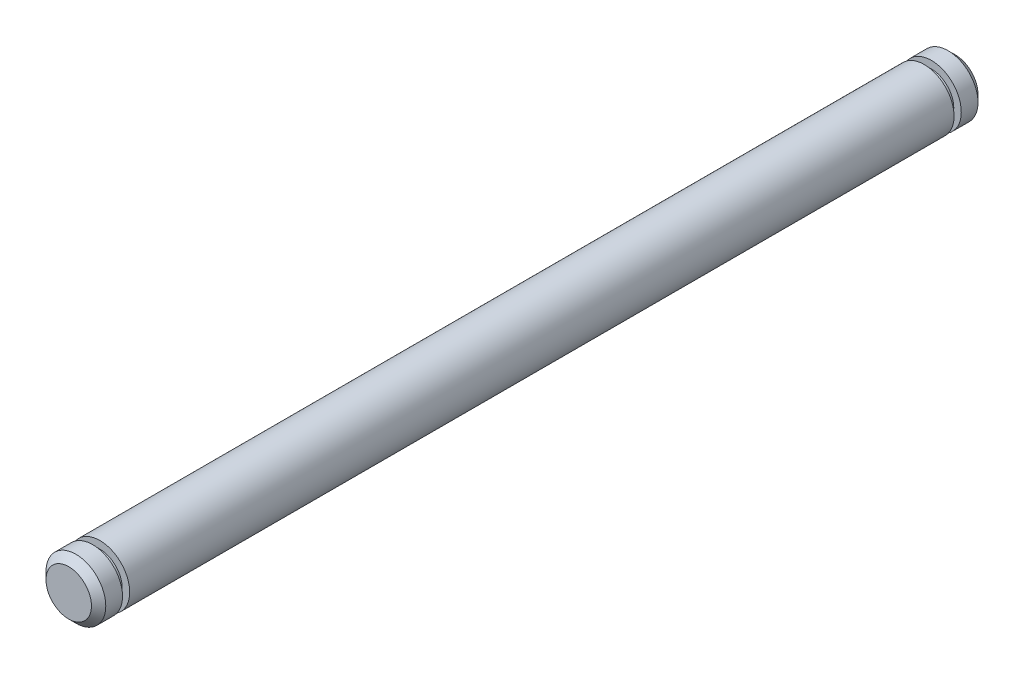
ISO-10303-21;
HEADER;
FILE_DESCRIPTION(('STEP AP214'),'2;1');
FILE_NAME('part.step','',(''),(''),'','','');
FILE_SCHEMA(('AUTOMOTIVE_DESIGN { 1 0 10303 214 1 1 1 1 }'));
ENDSEC;
DATA;
#1=APPLICATION_CONTEXT('core data for automotive mechanical design processes');
#2=APPLICATION_PROTOCOL_DEFINITION('international standard','automotive_design',2000,#1);
#3=PRODUCT_CONTEXT('',#1,'mechanical');
#4=PRODUCT('Part','Part','',(#3));
#5=PRODUCT_RELATED_PRODUCT_CATEGORY('part','',(#4));
#6=PRODUCT_DEFINITION_FORMATION('','',#4);
#7=PRODUCT_DEFINITION_CONTEXT('part definition',#1,'design');
#8=PRODUCT_DEFINITION('design','',#6,#7);
#9=PRODUCT_DEFINITION_SHAPE('','',#8);
#10=(LENGTH_UNIT() NAMED_UNIT(*) SI_UNIT(.MILLI.,.METRE.));
#11=(NAMED_UNIT(*) PLANE_ANGLE_UNIT() SI_UNIT($,.RADIAN.));
#12=(NAMED_UNIT(*) SI_UNIT($,.STERADIAN.) SOLID_ANGLE_UNIT());
#13=UNCERTAINTY_MEASURE_WITH_UNIT(LENGTH_MEASURE(1.E-05),#10,'distance_accuracy_value','');
#14=(GEOMETRIC_REPRESENTATION_CONTEXT(3) GLOBAL_UNCERTAINTY_ASSIGNED_CONTEXT((#13)) GLOBAL_UNIT_ASSIGNED_CONTEXT((#10,
#11,#12)) REPRESENTATION_CONTEXT('',''));
#15=CARTESIAN_POINT('',(0.,0.,0.));
#16=DIRECTION('',(0.,0.,1.));
#17=DIRECTION('',(1.,0.,0.));
#18=AXIS2_PLACEMENT_3D('',#15,#16,#17);
#19=CARTESIAN_POINT('',(0.,0.,21.89226));
#20=DIRECTION('',(0.,0.,-1.));
#21=DIRECTION('',(-1.,0.,0.));
#22=AXIS2_PLACEMENT_3D('',#19,#20,#21);
#23=CYLINDRICAL_SURFACE('',#22,1.5875);
#24=CARTESIAN_POINT('',(0.,0.,21.89226));
#25=DIRECTION('',(0.,0.,1.));
#26=DIRECTION('',(1.,0.,0.));
#27=AXIS2_PLACEMENT_3D('',#24,#25,#26);
#28=CIRCLE('',#27,1.5875);
#29=CARTESIAN_POINT('',(-1.5875,0.,21.89226));
#30=VERTEX_POINT('',#29);
#31=EDGE_CURVE('E68',#30,#30,#28,.T.);
#32=CARTESIAN_POINT('',(0.,0.,-21.89226));
#33=DIRECTION('',(0.,0.,1.));
#34=DIRECTION('',(1.,0.,0.));
#35=AXIS2_PLACEMENT_3D('',#32,#33,#34);
#36=CIRCLE('',#35,1.5875);
#37=CARTESIAN_POINT('',(-1.5875,0.,-21.89226));
#38=VERTEX_POINT('',#37);
#39=EDGE_CURVE('E65',#38,#38,#36,.T.);
#40=CARTESIAN_POINT('',(-1.5875,0.,21.89226));
#41=CARTESIAN_POINT('',(-1.5875,0.,21.43617125));
#42=CARTESIAN_POINT('',(-1.5875,0.,20.9800825));
#43=CARTESIAN_POINT('',(-1.5875,0.,20.067905));
#44=CARTESIAN_POINT('',(-1.5875,0.,19.61181625));
#45=CARTESIAN_POINT('',(-1.5875,0.,18.69963875));
#46=CARTESIAN_POINT('',(-1.5875,0.,18.24355));
#47=CARTESIAN_POINT('',(-1.5875,0.,17.3313725));
#48=CARTESIAN_POINT('',(-1.5875,0.,16.87528375));
#49=CARTESIAN_POINT('',(-1.5875,0.,15.96310625));
#50=CARTESIAN_POINT('',(-1.5875,0.,15.5070175));
#51=CARTESIAN_POINT('',(-1.5875,0.,14.59484));
#52=CARTESIAN_POINT('',(-1.5875,0.,14.13875125));
#53=CARTESIAN_POINT('',(-1.5875,0.,13.22657375));
#54=CARTESIAN_POINT('',(-1.5875,0.,12.770485));
#55=CARTESIAN_POINT('',(-1.5875,0.,11.8583075));
#56=CARTESIAN_POINT('',(-1.5875,0.,11.40221875));
#57=CARTESIAN_POINT('',(-1.5875,0.,10.49004125));
#58=CARTESIAN_POINT('',(-1.5875,0.,10.0339525));
#59=CARTESIAN_POINT('',(-1.5875,0.,9.121775));
#60=CARTESIAN_POINT('',(-1.5875,0.,8.66568625));
#61=CARTESIAN_POINT('',(-1.5875,0.,7.75350875));
#62=CARTESIAN_POINT('',(-1.5875,0.,7.29742));
#63=CARTESIAN_POINT('',(-1.5875,0.,6.3852425));
#64=CARTESIAN_POINT('',(-1.5875,0.,5.92915375));
#65=CARTESIAN_POINT('',(-1.5875,0.,5.01697625));
#66=CARTESIAN_POINT('',(-1.5875,0.,4.5608875));
#67=CARTESIAN_POINT('',(-1.5875,0.,3.64871));
#68=CARTESIAN_POINT('',(-1.5875,0.,3.19262125));
#69=CARTESIAN_POINT('',(-1.5875,0.,2.28044375));
#70=CARTESIAN_POINT('',(-1.5875,0.,1.824355));
#71=CARTESIAN_POINT('',(-1.5875,0.,0.912177499999996));
#72=CARTESIAN_POINT('',(-1.5875,0.,0.456088749999996));
#73=CARTESIAN_POINT('',(-1.5875,0.,-0.456088750000003));
#74=CARTESIAN_POINT('',(-1.5875,0.,-0.912177500000003));
#75=CARTESIAN_POINT('',(-1.5875,0.,-1.824355));
#76=CARTESIAN_POINT('',(-1.5875,0.,-2.28044375));
#77=CARTESIAN_POINT('',(-1.5875,0.,-3.19262125));
#78=CARTESIAN_POINT('',(-1.5875,0.,-3.64871));
#79=CARTESIAN_POINT('',(-1.5875,0.,-4.5608875));
#80=CARTESIAN_POINT('',(-1.5875,0.,-5.01697625));
#81=CARTESIAN_POINT('',(-1.5875,0.,-5.92915375));
#82=CARTESIAN_POINT('',(-1.5875,0.,-6.3852425));
#83=CARTESIAN_POINT('',(-1.5875,0.,-7.29742000000001));
#84=CARTESIAN_POINT('',(-1.5875,0.,-7.75350875000001));
#85=CARTESIAN_POINT('',(-1.5875,0.,-8.66568625));
#86=CARTESIAN_POINT('',(-1.5875,0.,-9.121775));
#87=CARTESIAN_POINT('',(-1.5875,0.,-10.0339525));
#88=CARTESIAN_POINT('',(-1.5875,0.,-10.49004125));
#89=CARTESIAN_POINT('',(-1.5875,0.,-11.40221875));
#90=CARTESIAN_POINT('',(-1.5875,0.,-11.8583075));
#91=CARTESIAN_POINT('',(-1.5875,0.,-12.770485));
#92=CARTESIAN_POINT('',(-1.5875,0.,-13.22657375));
#93=CARTESIAN_POINT('',(-1.5875,0.,-14.13875125));
#94=CARTESIAN_POINT('',(-1.5875,0.,-14.59484));
#95=CARTESIAN_POINT('',(-1.5875,0.,-15.5070175));
#96=CARTESIAN_POINT('',(-1.5875,0.,-15.96310625));
#97=CARTESIAN_POINT('',(-1.5875,0.,-16.87528375));
#98=CARTESIAN_POINT('',(-1.5875,0.,-17.3313725));
#99=CARTESIAN_POINT('',(-1.5875,0.,-18.24355));
#100=CARTESIAN_POINT('',(-1.5875,0.,-18.69963875));
#101=CARTESIAN_POINT('',(-1.5875,0.,-19.61181625));
#102=CARTESIAN_POINT('',(-1.5875,0.,-20.067905));
#103=CARTESIAN_POINT('',(-1.5875,0.,-20.9800825));
#104=CARTESIAN_POINT('',(-1.5875,0.,-21.43617125));
#105=CARTESIAN_POINT('',(-1.5875,0.,-21.89226));
#106=B_SPLINE_CURVE_WITH_KNOTS('',3,(#40,#41,#42,#43,#44,#45,#46,#47,#48,#49,#50,#51,#52,#53,
#54,#55,#56,#57,#58,#59,#60,#61,#62,#63,#64,#65,#66,#67,#68,#69,#70,#71,#72,#73,#74,#75,#76,#77,
#78,#79,#80,#81,#82,#83,#84,#85,#86,#87,#88,#89,#90,#91,#92,#93,#94,#95,#96,#97,#98,#99,#100,
#101,#102,#103,#104,#105),.UNSPECIFIED.,.F.,.F.,(4,2,2,2,2,2,2,2,2,2,2,2,2,2,2,2,2,2,2,2,2,2,2,
2,2,2,2,2,2,2,2,2,4),(0.,1.36826625,2.7365325,4.10479875,5.473065,6.84133125,8.2095975,
9.57786375,10.94613,12.31439625,13.6826625,15.05092875,16.419195,17.78746125,19.1557275,
20.52399375,21.89226,23.26052625,24.6287925,25.99705875,27.365325,28.73359125,30.1018575,
31.47012375,32.83839,34.20665625,35.5749225,36.94318875,38.311455,39.67972125,41.0479875,
42.41625375,43.78452),.UNSPECIFIED.);
#107=EDGE_CURVE('BSEAM43',#30,#38,#106,.T.);
#108=ORIENTED_EDGE('',*,*,#31,.F.);
#109=ORIENTED_EDGE('',*,*,#39,.T.);
#110=ORIENTED_EDGE('',*,*,#107,.T.);
#111=ORIENTED_EDGE('',*,*,#107,.F.);
#112=EDGE_LOOP('',(#108,#110,#109,#111));
#113=FACE_BOUND('',#112,.T.);
#114=ADVANCED_FACE('F43',(#113),#23,.T.);
#115=CARTESIAN_POINT('',(0.,0.,21.89226));
#116=DIRECTION('',(0.,0.,1.));
#117=DIRECTION('',(1.,0.,0.));
#118=AXIS2_PLACEMENT_3D('',#115,#116,#117);
#119=PLANE('',#118);
#120=CARTESIAN_POINT('',(0.,0.,21.89226));
#121=DIRECTION('',(0.,0.,1.));
#122=DIRECTION('',(1.,0.,0.));
#123=AXIS2_PLACEMENT_3D('',#120,#121,#122);
#124=CIRCLE('',#123,1.19126);
#125=CARTESIAN_POINT('',(-1.19126,0.,21.89226));
#126=VERTEX_POINT('',#125);
#127=EDGE_CURVE('E64',#126,#126,#124,.T.);
#128=ORIENTED_EDGE('',*,*,#127,.F.);
#129=EDGE_LOOP('',(#128));
#130=FACE_BOUND('',#129,.T.);
#131=ORIENTED_EDGE('',*,*,#31,.T.);
#132=EDGE_LOOP('',(#131));
#133=FACE_BOUND('',#132,.T.);
#134=ADVANCED_FACE('F106',(#130,#133),#119,.T.);
#135=CARTESIAN_POINT('',(0.,0.,-21.89226));
#136=DIRECTION('',(0.,0.,1.));
#137=DIRECTION('',(1.,0.,0.));
#138=AXIS2_PLACEMENT_3D('',#135,#136,#137);
#139=PLANE('',#138);
#140=CARTESIAN_POINT('',(0.,0.,-21.89226));
#141=DIRECTION('',(0.,0.,1.));
#142=DIRECTION('',(1.,0.,0.));
#143=AXIS2_PLACEMENT_3D('',#140,#141,#142);
#144=CIRCLE('',#143,1.19126);
#145=CARTESIAN_POINT('',(1.19126,0.,-21.89226));
#146=VERTEX_POINT('',#145);
#147=EDGE_CURVE('E79',#146,#146,#144,.T.);
#148=ORIENTED_EDGE('',*,*,#147,.T.);
#149=EDGE_LOOP('',(#148));
#150=FACE_BOUND('',#149,.T.);
#151=ORIENTED_EDGE('',*,*,#39,.F.);
#152=EDGE_LOOP('',(#151));
#153=FACE_BOUND('',#152,.T.);
#154=ADVANCED_FACE('F112',(#150,#153),#139,.F.);
#155=CARTESIAN_POINT('',(0.,0.,22.27326));
#156=DIRECTION('',(0.,0.,-1.));
#157=DIRECTION('',(-1.,0.,0.));
#158=AXIS2_PLACEMENT_3D('',#155,#156,#157);
#159=CYLINDRICAL_SURFACE('',#158,1.19126);
#160=CARTESIAN_POINT('',(0.,0.,22.27326));
#161=DIRECTION('',(0.,0.,1.));
#162=DIRECTION('',(1.,0.,0.));
#163=AXIS2_PLACEMENT_3D('',#160,#161,#162);
#164=CIRCLE('',#163,1.19126);
#165=CARTESIAN_POINT('',(-1.19126,0.,22.27326));
#166=VERTEX_POINT('',#165);
#167=EDGE_CURVE('E69',#166,#166,#164,.T.);
#168=CARTESIAN_POINT('',(-1.19126,0.,22.27326));
#169=CARTESIAN_POINT('',(-1.19126,0.,22.26929125));
#170=CARTESIAN_POINT('',(-1.19126,0.,22.2653225));
#171=CARTESIAN_POINT('',(-1.19126,0.,22.257385));
#172=CARTESIAN_POINT('',(-1.19126,0.,22.25341625));
#173=CARTESIAN_POINT('',(-1.19126,0.,22.24547875));
#174=CARTESIAN_POINT('',(-1.19126,0.,22.24151));
#175=CARTESIAN_POINT('',(-1.19126,0.,22.2335725));
#176=CARTESIAN_POINT('',(-1.19126,0.,22.22960375));
#177=CARTESIAN_POINT('',(-1.19126,0.,22.22166625));
#178=CARTESIAN_POINT('',(-1.19126,0.,22.2176975));
#179=CARTESIAN_POINT('',(-1.19126,0.,22.20976));
#180=CARTESIAN_POINT('',(-1.19126,0.,22.20579125));
#181=CARTESIAN_POINT('',(-1.19126,0.,22.19785375));
#182=CARTESIAN_POINT('',(-1.19126,0.,22.193885));
#183=CARTESIAN_POINT('',(-1.19126,0.,22.1859475));
#184=CARTESIAN_POINT('',(-1.19126,0.,22.18197875));
#185=CARTESIAN_POINT('',(-1.19126,0.,22.17404125));
#186=CARTESIAN_POINT('',(-1.19126,0.,22.1700725));
#187=CARTESIAN_POINT('',(-1.19126,0.,22.162135));
#188=CARTESIAN_POINT('',(-1.19126,0.,22.15816625));
#189=CARTESIAN_POINT('',(-1.19126,0.,22.15022875));
#190=CARTESIAN_POINT('',(-1.19126,0.,22.14626));
#191=CARTESIAN_POINT('',(-1.19126,0.,22.1383225));
#192=CARTESIAN_POINT('',(-1.19126,0.,22.13435375));
#193=CARTESIAN_POINT('',(-1.19126,0.,22.12641625));
#194=CARTESIAN_POINT('',(-1.19126,0.,22.1224475));
#195=CARTESIAN_POINT('',(-1.19126,0.,22.11451));
#196=CARTESIAN_POINT('',(-1.19126,0.,22.11054125));
#197=CARTESIAN_POINT('',(-1.19126,0.,22.10260375));
#198=CARTESIAN_POINT('',(-1.19126,0.,22.098635));
#199=CARTESIAN_POINT('',(-1.19126,0.,22.0906975));
#200=CARTESIAN_POINT('',(-1.19126,0.,22.08672875));
#201=CARTESIAN_POINT('',(-1.19126,0.,22.07879125));
#202=CARTESIAN_POINT('',(-1.19126,0.,22.0748225));
#203=CARTESIAN_POINT('',(-1.19126,0.,22.066885));
#204=CARTESIAN_POINT('',(-1.19126,0.,22.06291625));
#205=CARTESIAN_POINT('',(-1.19126,0.,22.05497875));
#206=CARTESIAN_POINT('',(-1.19126,0.,22.05101));
#207=CARTESIAN_POINT('',(-1.19126,0.,22.0430725));
#208=CARTESIAN_POINT('',(-1.19126,0.,22.03910375));
#209=CARTESIAN_POINT('',(-1.19126,0.,22.03116625));
#210=CARTESIAN_POINT('',(-1.19126,0.,22.0271975));
#211=CARTESIAN_POINT('',(-1.19126,0.,22.01926));
#212=CARTESIAN_POINT('',(-1.19126,0.,22.01529125));
#213=CARTESIAN_POINT('',(-1.19126,0.,22.00735375));
#214=CARTESIAN_POINT('',(-1.19126,0.,22.003385));
#215=CARTESIAN_POINT('',(-1.19126,0.,21.9954475));
#216=CARTESIAN_POINT('',(-1.19126,0.,21.99147875));
#217=CARTESIAN_POINT('',(-1.19126,0.,21.98354125));
#218=CARTESIAN_POINT('',(-1.19126,0.,21.9795725));
#219=CARTESIAN_POINT('',(-1.19126,0.,21.971635));
#220=CARTESIAN_POINT('',(-1.19126,0.,21.96766625));
#221=CARTESIAN_POINT('',(-1.19126,0.,21.95972875));
#222=CARTESIAN_POINT('',(-1.19126,0.,21.95576));
#223=CARTESIAN_POINT('',(-1.19126,0.,21.9478225));
#224=CARTESIAN_POINT('',(-1.19126,0.,21.94385375));
#225=CARTESIAN_POINT('',(-1.19126,0.,21.93591625));
#226=CARTESIAN_POINT('',(-1.19126,0.,21.9319475));
#227=CARTESIAN_POINT('',(-1.19126,0.,21.92401));
#228=CARTESIAN_POINT('',(-1.19126,0.,21.92004125));
#229=CARTESIAN_POINT('',(-1.19126,0.,21.91210375));
#230=CARTESIAN_POINT('',(-1.19126,0.,21.908135));
#231=CARTESIAN_POINT('',(-1.19126,0.,21.9001975));
#232=CARTESIAN_POINT('',(-1.19126,0.,21.89622875));
#233=CARTESIAN_POINT('',(-1.19126,0.,21.89226));
#234=B_SPLINE_CURVE_WITH_KNOTS('',3,(#168,#169,#170,#171,#172,#173,#174,#175,#176,#177,#178,
#179,#180,#181,#182,#183,#184,#185,#186,#187,#188,#189,#190,#191,#192,#193,#194,#195,#196,#197,
#198,#199,#200,#201,#202,#203,#204,#205,#206,#207,#208,#209,#210,#211,#212,#213,#214,#215,#216,
#217,#218,#219,#220,#221,#222,#223,#224,#225,#226,#227,#228,#229,#230,#231,#232,#233),
.UNSPECIFIED.,.F.,.F.,(4,2,2,2,2,2,2,2,2,2,2,2,2,2,2,2,2,2,2,2,2,2,2,2,2,2,2,2,2,2,2,2,4),(0.,
0.0119062499999989,0.0238124999999978,0.0357187499999967,0.0476249999999991,0.059531249999998,
0.0714374999999969,0.0833437499999992,0.0952499999999981,0.107156249999997,0.119062499999999,
0.130968749999998,0.142874999999997,0.15478125,0.166687499999998,0.178593749999997,
0.190499999999996,0.202406249999999,0.214312499999997,0.226218749999996,0.238124999999999,
0.250031249999998,0.261937499999997,0.273843749999999,0.285749999999998,0.297656249999997,
0.309562499999999,0.321468749999998,0.333374999999997,0.345281249999999,0.357187499999998,
0.369093749999997,0.380999999999996),.UNSPECIFIED.);
#235=EDGE_CURVE('BSEAM141',#166,#126,#234,.T.);
#236=ORIENTED_EDGE('',*,*,#167,.F.);
#237=ORIENTED_EDGE('',*,*,#127,.T.);
#238=ORIENTED_EDGE('',*,*,#235,.T.);
#239=ORIENTED_EDGE('',*,*,#235,.F.);
#240=EDGE_LOOP('',(#236,#238,#237,#239));
#241=FACE_BOUND('',#240,.T.);
#242=ADVANCED_FACE('F141',(#241),#159,.T.);
#243=CARTESIAN_POINT('',(0.,0.,23.54326));
#244=DIRECTION('',(0.,0.,-1.));
#245=DIRECTION('',(-1.,0.,0.));
#246=AXIS2_PLACEMENT_3D('',#243,#244,#245);
#247=CYLINDRICAL_SURFACE('',#246,1.5875);
#248=CARTESIAN_POINT('',(0.,0.,23.16226));
#249=DIRECTION('',(0.,0.,1.));
#250=DIRECTION('',(1.,0.,0.));
#251=AXIS2_PLACEMENT_3D('',#248,#249,#250);
#252=CIRCLE('',#251,1.5875);
#253=CARTESIAN_POINT('',(1.5875,0.,23.16226));
#254=VERTEX_POINT('',#253);
#255=EDGE_CURVE('E55',#254,#254,#252,.F.);
#256=ORIENTED_EDGE('',*,*,#255,.T.);
#257=EDGE_LOOP('',(#256));
#258=FACE_BOUND('',#257,.T.);
#259=CARTESIAN_POINT('',(0.,0.,22.27326));
#260=DIRECTION('',(0.,0.,1.));
#261=DIRECTION('',(1.,0.,0.));
#262=AXIS2_PLACEMENT_3D('',#259,#260,#261);
#263=CIRCLE('',#262,1.5875);
#264=CARTESIAN_POINT('',(1.5875,0.,22.27326));
#265=VERTEX_POINT('',#264);
#266=EDGE_CURVE('E76',#265,#265,#263,.T.);
#267=ORIENTED_EDGE('',*,*,#266,.T.);
#268=EDGE_LOOP('',(#267));
#269=FACE_BOUND('',#268,.T.);
#270=ADVANCED_FACE('F136',(#258,#269),#247,.T.);
#271=CARTESIAN_POINT('',(0.,0.,23.54326));
#272=DIRECTION('',(0.,0.,1.));
#273=DIRECTION('',(1.,0.,0.));
#274=AXIS2_PLACEMENT_3D('',#271,#272,#273);
#275=PLANE('',#274);
#276=CARTESIAN_POINT('',(0.,0.,23.54326));
#277=DIRECTION('',(0.,0.,1.));
#278=DIRECTION('',(1.,0.,0.));
#279=AXIS2_PLACEMENT_3D('',#276,#277,#278);
#280=CIRCLE('',#279,1.20650000000001);
#281=CARTESIAN_POINT('',(1.20650000000001,0.,23.54326));
#282=VERTEX_POINT('',#281);
#283=EDGE_CURVE('E59',#282,#282,#280,.T.);
#284=ORIENTED_EDGE('',*,*,#283,.T.);
#285=EDGE_LOOP('',(#284));
#286=FACE_BOUND('',#285,.T.);
#287=ADVANCED_FACE('F129',(#286),#275,.T.);
#288=CARTESIAN_POINT('',(0.,0.,22.27326));
#289=DIRECTION('',(0.,0.,1.));
#290=DIRECTION('',(1.,0.,0.));
#291=AXIS2_PLACEMENT_3D('',#288,#289,#290);
#292=PLANE('',#291);
#293=ORIENTED_EDGE('',*,*,#167,.T.);
#294=EDGE_LOOP('',(#293));
#295=FACE_BOUND('',#294,.T.);
#296=ORIENTED_EDGE('',*,*,#266,.F.);
#297=EDGE_LOOP('',(#296));
#298=FACE_BOUND('',#297,.T.);
#299=ADVANCED_FACE('F122',(#295,#298),#292,.F.);
#300=CARTESIAN_POINT('',(0.,0.,23.54326));
#301=DIRECTION('',(0.,0.,-1.));
#302=DIRECTION('',(-1.,0.,0.));
#303=AXIS2_PLACEMENT_3D('',#300,#301,#302);
#304=CONICAL_SURFACE('',#303,1.20650000000001,0.785398163397441);
#305=ORIENTED_EDGE('',*,*,#255,.F.);
#306=EDGE_LOOP('',(#305));
#307=FACE_BOUND('',#306,.T.);
#308=ORIENTED_EDGE('',*,*,#283,.F.);
#309=EDGE_LOOP('',(#308));
#310=FACE_BOUND('',#309,.T.);
#311=ADVANCED_FACE('F101',(#307,#310),#304,.T.);
#312=CARTESIAN_POINT('',(0.,0.,-22.27326));
#313=DIRECTION('',(0.,0.,1.));
#314=DIRECTION('',(1.,0.,0.));
#315=AXIS2_PLACEMENT_3D('',#312,#313,#314);
#316=CYLINDRICAL_SURFACE('',#315,1.19126);
#317=CARTESIAN_POINT('',(0.,0.,-22.27326));
#318=DIRECTION('',(0.,0.,1.));
#319=DIRECTION('',(1.,0.,0.));
#320=AXIS2_PLACEMENT_3D('',#317,#318,#319);
#321=CIRCLE('',#320,1.19126);
#322=CARTESIAN_POINT('',(1.19126,0.,-22.27326));
#323=VERTEX_POINT('',#322);
#324=EDGE_CURVE('E82',#323,#323,#321,.T.);
#325=CARTESIAN_POINT('',(1.19126,0.,-22.27326));
#326=CARTESIAN_POINT('',(1.19126,0.,-22.26929125));
#327=CARTESIAN_POINT('',(1.19126,0.,-22.2653225));
#328=CARTESIAN_POINT('',(1.19126,0.,-22.257385));
#329=CARTESIAN_POINT('',(1.19126,0.,-22.25341625));
#330=CARTESIAN_POINT('',(1.19126,0.,-22.24547875));
#331=CARTESIAN_POINT('',(1.19126,0.,-22.24151));
#332=CARTESIAN_POINT('',(1.19126,0.,-22.2335725));
#333=CARTESIAN_POINT('',(1.19126,0.,-22.22960375));
#334=CARTESIAN_POINT('',(1.19126,0.,-22.22166625));
#335=CARTESIAN_POINT('',(1.19126,0.,-22.2176975));
#336=CARTESIAN_POINT('',(1.19126,0.,-22.20976));
#337=CARTESIAN_POINT('',(1.19126,0.,-22.20579125));
#338=CARTESIAN_POINT('',(1.19126,0.,-22.19785375));
#339=CARTESIAN_POINT('',(1.19126,0.,-22.193885));
#340=CARTESIAN_POINT('',(1.19126,0.,-22.1859475));
#341=CARTESIAN_POINT('',(1.19126,0.,-22.18197875));
#342=CARTESIAN_POINT('',(1.19126,0.,-22.17404125));
#343=CARTESIAN_POINT('',(1.19126,0.,-22.1700725));
#344=CARTESIAN_POINT('',(1.19126,0.,-22.162135));
#345=CARTESIAN_POINT('',(1.19126,0.,-22.15816625));
#346=CARTESIAN_POINT('',(1.19126,0.,-22.15022875));
#347=CARTESIAN_POINT('',(1.19126,0.,-22.14626));
#348=CARTESIAN_POINT('',(1.19126,0.,-22.1383225));
#349=CARTESIAN_POINT('',(1.19126,0.,-22.13435375));
#350=CARTESIAN_POINT('',(1.19126,0.,-22.12641625));
#351=CARTESIAN_POINT('',(1.19126,0.,-22.1224475));
#352=CARTESIAN_POINT('',(1.19126,0.,-22.11451));
#353=CARTESIAN_POINT('',(1.19126,0.,-22.11054125));
#354=CARTESIAN_POINT('',(1.19126,0.,-22.10260375));
#355=CARTESIAN_POINT('',(1.19126,0.,-22.098635));
#356=CARTESIAN_POINT('',(1.19126,0.,-22.0906975));
#357=CARTESIAN_POINT('',(1.19126,0.,-22.08672875));
#358=CARTESIAN_POINT('',(1.19126,0.,-22.07879125));
#359=CARTESIAN_POINT('',(1.19126,0.,-22.0748225));
#360=CARTESIAN_POINT('',(1.19126,0.,-22.066885));
#361=CARTESIAN_POINT('',(1.19126,0.,-22.06291625));
#362=CARTESIAN_POINT('',(1.19126,0.,-22.05497875));
#363=CARTESIAN_POINT('',(1.19126,0.,-22.05101));
#364=CARTESIAN_POINT('',(1.19126,0.,-22.0430725));
#365=CARTESIAN_POINT('',(1.19126,0.,-22.03910375));
#366=CARTESIAN_POINT('',(1.19126,0.,-22.03116625));
#367=CARTESIAN_POINT('',(1.19126,0.,-22.0271975));
#368=CARTESIAN_POINT('',(1.19126,0.,-22.01926));
#369=CARTESIAN_POINT('',(1.19126,0.,-22.01529125));
#370=CARTESIAN_POINT('',(1.19126,0.,-22.00735375));
#371=CARTESIAN_POINT('',(1.19126,0.,-22.003385));
#372=CARTESIAN_POINT('',(1.19126,0.,-21.9954475));
#373=CARTESIAN_POINT('',(1.19126,0.,-21.99147875));
#374=CARTESIAN_POINT('',(1.19126,0.,-21.98354125));
#375=CARTESIAN_POINT('',(1.19126,0.,-21.9795725));
#376=CARTESIAN_POINT('',(1.19126,0.,-21.971635));
#377=CARTESIAN_POINT('',(1.19126,0.,-21.96766625));
#378=CARTESIAN_POINT('',(1.19126,0.,-21.95972875));
#379=CARTESIAN_POINT('',(1.19126,0.,-21.95576));
#380=CARTESIAN_POINT('',(1.19126,0.,-21.9478225));
#381=CARTESIAN_POINT('',(1.19126,0.,-21.94385375));
#382=CARTESIAN_POINT('',(1.19126,0.,-21.93591625));
#383=CARTESIAN_POINT('',(1.19126,0.,-21.9319475));
#384=CARTESIAN_POINT('',(1.19126,0.,-21.92401));
#385=CARTESIAN_POINT('',(1.19126,0.,-21.92004125));
#386=CARTESIAN_POINT('',(1.19126,0.,-21.91210375));
#387=CARTESIAN_POINT('',(1.19126,0.,-21.908135));
#388=CARTESIAN_POINT('',(1.19126,0.,-21.9001975));
#389=CARTESIAN_POINT('',(1.19126,0.,-21.89622875));
#390=CARTESIAN_POINT('',(1.19126,0.,-21.89226));
#391=B_SPLINE_CURVE_WITH_KNOTS('',3,(#325,#326,#327,#328,#329,#330,#331,#332,#333,#334,#335,
#336,#337,#338,#339,#340,#341,#342,#343,#344,#345,#346,#347,#348,#349,#350,#351,#352,#353,#354,
#355,#356,#357,#358,#359,#360,#361,#362,#363,#364,#365,#366,#367,#368,#369,#370,#371,#372,#373,
#374,#375,#376,#377,#378,#379,#380,#381,#382,#383,#384,#385,#386,#387,#388,#389,#390),
.UNSPECIFIED.,.F.,.F.,(4,2,2,2,2,2,2,2,2,2,2,2,2,2,2,2,2,2,2,2,2,2,2,2,2,2,2,2,2,2,2,2,4),(0.,
0.0119062500000024,0.0238125000000013,0.0357187500000002,0.0476250000000025,0.0595312500000014,
0.0714375000000003,0.0833437500000027,0.0952500000000016,0.10715625,0.119062500000003,
0.130968750000002,0.142875000000001,0.154781250000003,0.166687500000002,0.178593750000001,
0.190500000000003,0.202406250000002,0.214312500000001,0.22621875,0.238125000000002,
0.250031250000001,0.2619375,0.273843750000002,0.285750000000001,0.29765625,0.309562500000003,
0.321468750000001,0.333375,0.345281250000003,0.357187500000002,0.36909375,0.381000000000003),.UNSPECIFIED.);
#392=EDGE_CURVE('BSEAM94',#323,#146,#391,.T.);
#393=ORIENTED_EDGE('',*,*,#324,.T.);
#394=ORIENTED_EDGE('',*,*,#147,.F.);
#395=ORIENTED_EDGE('',*,*,#392,.T.);
#396=ORIENTED_EDGE('',*,*,#392,.F.);
#397=EDGE_LOOP('',(#393,#395,#394,#396));
#398=FACE_BOUND('',#397,.T.);
#399=ADVANCED_FACE('F94',(#398),#316,.T.);
#400=CARTESIAN_POINT('',(0.,0.,-23.54326));
#401=DIRECTION('',(0.,0.,1.));
#402=DIRECTION('',(1.,0.,0.));
#403=AXIS2_PLACEMENT_3D('',#400,#401,#402);
#404=CYLINDRICAL_SURFACE('',#403,1.5875);
#405=CARTESIAN_POINT('',(0.,0.,-23.16226));
#406=DIRECTION('',(0.,0.,-1.));
#407=DIRECTION('',(-1.,0.,0.));
#408=AXIS2_PLACEMENT_3D('',#405,#406,#407);
#409=CIRCLE('',#408,1.5875);
#410=CARTESIAN_POINT('',(1.5875,0.,-23.16226));
#411=VERTEX_POINT('',#410);
#412=EDGE_CURVE('E51',#411,#411,#409,.F.);
#413=ORIENTED_EDGE('',*,*,#412,.T.);
#414=EDGE_LOOP('',(#413));
#415=FACE_BOUND('',#414,.T.);
#416=CARTESIAN_POINT('',(0.,0.,-22.27326));
#417=DIRECTION('',(0.,0.,1.));
#418=DIRECTION('',(1.,0.,0.));
#419=AXIS2_PLACEMENT_3D('',#416,#417,#418);
#420=CIRCLE('',#419,1.5875);
#421=CARTESIAN_POINT('',(1.5875,0.,-22.27326));
#422=VERTEX_POINT('',#421);
#423=EDGE_CURVE('E85',#422,#422,#420,.T.);
#424=ORIENTED_EDGE('',*,*,#423,.F.);
#425=EDGE_LOOP('',(#424));
#426=FACE_BOUND('',#425,.T.);
#427=ADVANCED_FACE('F91',(#415,#426),#404,.T.);
#428=CARTESIAN_POINT('',(0.,0.,-23.54326));
#429=DIRECTION('',(0.,0.,-1.));
#430=DIRECTION('',(1.,0.,0.));
#431=AXIS2_PLACEMENT_3D('',#428,#429,#430);
#432=PLANE('',#431);
#433=CARTESIAN_POINT('',(0.,0.,-23.54326));
#434=DIRECTION('',(0.,0.,-1.));
#435=DIRECTION('',(-1.,0.,0.));
#436=AXIS2_PLACEMENT_3D('',#433,#434,#435);
#437=CIRCLE('',#436,1.2065);
#438=CARTESIAN_POINT('',(1.2065,0.,-23.54326));
#439=VERTEX_POINT('',#438);
#440=EDGE_CURVE('E10',#439,#439,#437,.T.);
#441=ORIENTED_EDGE('',*,*,#440,.T.);
#442=EDGE_LOOP('',(#441));
#443=FACE_BOUND('',#442,.T.);
#444=ADVANCED_FACE('F93',(#443),#432,.T.);
#445=CARTESIAN_POINT('',(0.,0.,-22.27326));
#446=DIRECTION('',(0.,0.,-1.));
#447=DIRECTION('',(1.,0.,0.));
#448=AXIS2_PLACEMENT_3D('',#445,#446,#447);
#449=PLANE('',#448);
#450=ORIENTED_EDGE('',*,*,#324,.F.);
#451=EDGE_LOOP('',(#450));
#452=FACE_BOUND('',#451,.T.);
#453=ORIENTED_EDGE('',*,*,#423,.T.);
#454=EDGE_LOOP('',(#453));
#455=FACE_BOUND('',#454,.T.);
#456=ADVANCED_FACE('F89',(#452,#455),#449,.F.);
#457=CARTESIAN_POINT('',(0.,0.,-23.16226));
#458=DIRECTION('',(0.,0.,1.));
#459=DIRECTION('',(1.,0.,0.));
#460=AXIS2_PLACEMENT_3D('',#457,#458,#459);
#461=CONICAL_SURFACE('',#460,1.5875,0.785398163397443);
#462=CARTESIAN_POINT('',(1.2065,0.,-23.54326));
#463=CARTESIAN_POINT('',(1.21046875,0.,-23.53929125));
#464=CARTESIAN_POINT('',(1.2144375,0.,-23.5353225));
#465=CARTESIAN_POINT('',(1.222375,0.,-23.527385));
#466=CARTESIAN_POINT('',(1.22634375,0.,-23.52341625));
#467=CARTESIAN_POINT('',(1.23428125,0.,-23.51547875));
#468=CARTESIAN_POINT('',(1.23825,0.,-23.51151));
#469=CARTESIAN_POINT('',(1.2461875,0.,-23.5035725));
#470=CARTESIAN_POINT('',(1.25015625,0.,-23.49960375));
#471=CARTESIAN_POINT('',(1.25809375,0.,-23.49166625));
#472=CARTESIAN_POINT('',(1.2620625,0.,-23.4876975));
#473=CARTESIAN_POINT('',(1.27,0.,-23.47976));
#474=CARTESIAN_POINT('',(1.27396875,0.,-23.47579125));
#475=CARTESIAN_POINT('',(1.28190625,0.,-23.46785375));
#476=CARTESIAN_POINT('',(1.285875,0.,-23.463885));
#477=CARTESIAN_POINT('',(1.2938125,0.,-23.4559475));
#478=CARTESIAN_POINT('',(1.29778125,0.,-23.45197875));
#479=CARTESIAN_POINT('',(1.30571875,0.,-23.44404125));
#480=CARTESIAN_POINT('',(1.3096875,0.,-23.4400725));
#481=CARTESIAN_POINT('',(1.317625,0.,-23.432135));
#482=CARTESIAN_POINT('',(1.32159375,0.,-23.42816625));
#483=CARTESIAN_POINT('',(1.32953125,0.,-23.42022875));
#484=CARTESIAN_POINT('',(1.3335,0.,-23.41626));
#485=CARTESIAN_POINT('',(1.3414375,0.,-23.4083225));
#486=CARTESIAN_POINT('',(1.34540625,0.,-23.40435375));
#487=CARTESIAN_POINT('',(1.35334375,0.,-23.39641625));
#488=CARTESIAN_POINT('',(1.3573125,0.,-23.3924475));
#489=CARTESIAN_POINT('',(1.36525,0.,-23.38451));
#490=CARTESIAN_POINT('',(1.36921875,0.,-23.38054125));
#491=CARTESIAN_POINT('',(1.37715625,0.,-23.37260375));
#492=CARTESIAN_POINT('',(1.381125,0.,-23.368635));
#493=CARTESIAN_POINT('',(1.3890625,0.,-23.3606975));
#494=CARTESIAN_POINT('',(1.39303125,0.,-23.35672875));
#495=CARTESIAN_POINT('',(1.40096875,0.,-23.34879125));
#496=CARTESIAN_POINT('',(1.4049375,0.,-23.3448225));
#497=CARTESIAN_POINT('',(1.412875,0.,-23.336885));
#498=CARTESIAN_POINT('',(1.41684375,0.,-23.33291625));
#499=CARTESIAN_POINT('',(1.42478125,0.,-23.32497875));
#500=CARTESIAN_POINT('',(1.42875,0.,-23.32101));
#501=CARTESIAN_POINT('',(1.4366875,0.,-23.3130725));
#502=CARTESIAN_POINT('',(1.44065625,0.,-23.30910375));
#503=CARTESIAN_POINT('',(1.44859375,0.,-23.30116625));
#504=CARTESIAN_POINT('',(1.4525625,0.,-23.2971975));
#505=CARTESIAN_POINT('',(1.4605,0.,-23.28926));
#506=CARTESIAN_POINT('',(1.46446875,0.,-23.28529125));
#507=CARTESIAN_POINT('',(1.47240625,0.,-23.27735375));
#508=CARTESIAN_POINT('',(1.476375,0.,-23.273385));
#509=CARTESIAN_POINT('',(1.4843125,0.,-23.2654475));
#510=CARTESIAN_POINT('',(1.48828125,0.,-23.26147875));
#511=CARTESIAN_POINT('',(1.49621875,0.,-23.25354125));
#512=CARTESIAN_POINT('',(1.5001875,0.,-23.2495725));
#513=CARTESIAN_POINT('',(1.508125,0.,-23.241635));
#514=CARTESIAN_POINT('',(1.51209375,0.,-23.23766625));
#515=CARTESIAN_POINT('',(1.52003125,0.,-23.22972875));
#516=CARTESIAN_POINT('',(1.524,0.,-23.22576));
#517=CARTESIAN_POINT('',(1.5319375,0.,-23.2178225));
#518=CARTESIAN_POINT('',(1.53590625,0.,-23.21385375));
#519=CARTESIAN_POINT('',(1.54384375,0.,-23.20591625));
#520=CARTESIAN_POINT('',(1.5478125,0.,-23.2019475));
#521=CARTESIAN_POINT('',(1.55575,0.,-23.19401));
#522=CARTESIAN_POINT('',(1.55971875,0.,-23.19004125));
#523=CARTESIAN_POINT('',(1.56765625,0.,-23.18210375));
#524=CARTESIAN_POINT('',(1.571625,0.,-23.178135));
#525=CARTESIAN_POINT('',(1.5795625,0.,-23.1701975));
#526=CARTESIAN_POINT('',(1.58353125,0.,-23.16622875));
#527=CARTESIAN_POINT('',(1.5875,0.,-23.16226));
#528=B_SPLINE_CURVE_WITH_KNOTS('',3,(#462,#463,#464,#465,#466,#467,#468,#469,#470,#471,#472,
#473,#474,#475,#476,#477,#478,#479,#480,#481,#482,#483,#484,#485,#486,#487,#488,#489,#490,#491,
#492,#493,#494,#495,#496,#497,#498,#499,#500,#501,#502,#503,#504,#505,#506,#507,#508,#509,#510,
#511,#512,#513,#514,#515,#516,#517,#518,#519,#520,#521,#522,#523,#524,#525,#526,#527),
.UNSPECIFIED.,.F.,.F.,(4,2,2,2,2,2,2,2,2,2,2,2,2,2,2,2,2,2,2,2,2,2,2,2,2,2,2,2,2,2,2,2,4),(0.,
0.0168379802270063,0.0336759604540103,0.0505139406810167,0.0673519209080205,0.0841899011350246,
0.101027881362031,0.117865861589035,0.134703841816039,0.151541822043045,0.168379802270049,
0.185217782497056,0.20205576272406,0.218893742951064,0.23573172317807,0.252569703405074,
0.269407683632078,0.286245663859084,0.303083644086088,0.319921624313095,0.336759604540098,
0.353597584767102,0.370435564994109,0.387273545221113,0.404111525448119,0.420949505675123,
0.437787485902127,0.454625466129133,0.471463446356137,0.488301426583141,0.505139406810148,
0.521977387037152,0.538815367264155),.UNSPECIFIED.);
#529=EDGE_CURVE('BSEAM46',#439,#411,#528,.T.);
#530=ORIENTED_EDGE('',*,*,#440,.F.);
#531=ORIENTED_EDGE('',*,*,#412,.F.);
#532=ORIENTED_EDGE('',*,*,#529,.T.);
#533=ORIENTED_EDGE('',*,*,#529,.F.);
#534=EDGE_LOOP('',(#530,#532,#531,#533));
#535=FACE_BOUND('',#534,.T.);
#536=ADVANCED_FACE('F46',(#535),#461,.T.);
#537=CLOSED_SHELL('',(#114,#134,#154,#242,#270,#287,#299,#311,#399,#427,#444,#456,#536));
#538=MANIFOLD_SOLID_BREP('B2',#537);
#539=ADVANCED_BREP_SHAPE_REPRESENTATION('',(#18,#538),#14);
#540=SHAPE_DEFINITION_REPRESENTATION(#9,#539);
ENDSEC;
END-ISO-10303-21;
